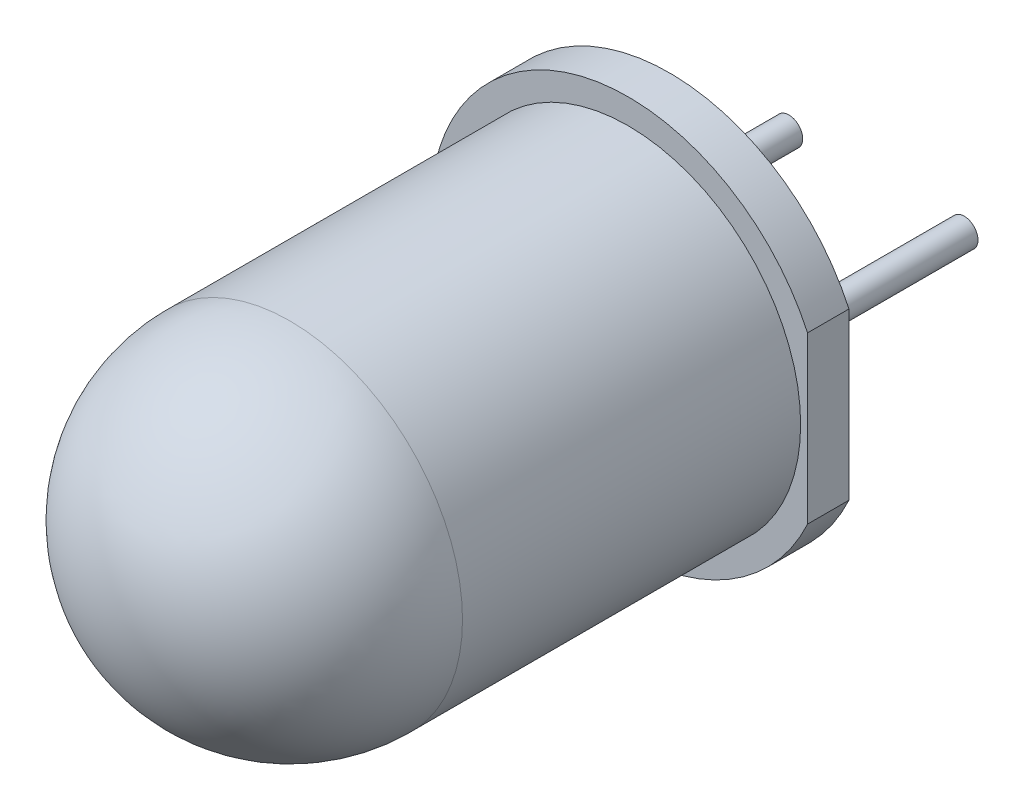
ISO-10303-21;
HEADER;
FILE_DESCRIPTION(('STEP AP214'),'2;1');
FILE_NAME('part.step','',(''),(''),'','','');
FILE_SCHEMA(('AUTOMOTIVE_DESIGN { 1 0 10303 214 1 1 1 1 }'));
ENDSEC;
DATA;
#1=APPLICATION_CONTEXT('core data for automotive mechanical design processes');
#2=APPLICATION_PROTOCOL_DEFINITION('international standard','automotive_design',2000,#1);
#3=PRODUCT_CONTEXT('',#1,'mechanical');
#4=PRODUCT('Part','Part','',(#3));
#5=PRODUCT_RELATED_PRODUCT_CATEGORY('part','',(#4));
#6=PRODUCT_DEFINITION_FORMATION('','',#4);
#7=PRODUCT_DEFINITION_CONTEXT('part definition',#1,'design');
#8=PRODUCT_DEFINITION('design','',#6,#7);
#9=PRODUCT_DEFINITION_SHAPE('','',#8);
#10=(LENGTH_UNIT() NAMED_UNIT(*) SI_UNIT(.MILLI.,.METRE.));
#11=(NAMED_UNIT(*) PLANE_ANGLE_UNIT() SI_UNIT($,.RADIAN.));
#12=(NAMED_UNIT(*) SI_UNIT($,.STERADIAN.) SOLID_ANGLE_UNIT());
#13=UNCERTAINTY_MEASURE_WITH_UNIT(LENGTH_MEASURE(1.E-05),#10,'distance_accuracy_value','');
#14=(GEOMETRIC_REPRESENTATION_CONTEXT(3) GLOBAL_UNCERTAINTY_ASSIGNED_CONTEXT((#13)) GLOBAL_UNIT_ASSIGNED_CONTEXT((#10,
#11,#12)) REPRESENTATION_CONTEXT('',''));
#15=CARTESIAN_POINT('',(0.,0.,0.));
#16=DIRECTION('',(0.,0.,1.));
#17=DIRECTION('',(1.,0.,0.));
#18=AXIS2_PLACEMENT_3D('',#15,#16,#17);
#19=CARTESIAN_POINT('',(0.,0.,0.));
#20=DIRECTION('',(0.,0.,1.));
#21=DIRECTION('',(1.,0.,0.));
#22=AXIS2_PLACEMENT_3D('',#19,#20,#21);
#23=PLANE('',#22);
#24=CARTESIAN_POINT('',(0.,0.,0.));
#25=DIRECTION('',(0.,0.,1.));
#26=DIRECTION('',(1.,0.,0.));
#27=AXIS2_PLACEMENT_3D('',#24,#25,#26);
#28=CIRCLE('',#27,2.86356421265527);
#29=CARTESIAN_POINT('',(2.6,1.2,0.));
#30=VERTEX_POINT('',#29);
#31=CARTESIAN_POINT('',(2.6,-1.2,0.));
#32=VERTEX_POINT('',#31);
#33=EDGE_CURVE('E72',#30,#32,#28,.T.);
#34=ORIENTED_EDGE('',*,*,#33,.F.);
#35=DIRECTION('',(0.,1.,0.));
#36=VECTOR('',#35,1.);
#37=CARTESIAN_POINT('',(2.6,1.2,0.));
#38=LINE('',#37,#36);
#39=EDGE_CURVE('E61',#32,#30,#38,.T.);
#40=ORIENTED_EDGE('',*,*,#39,.F.);
#41=EDGE_LOOP('',(#34,#40));
#42=FACE_BOUND('',#41,.T.);
#43=CARTESIAN_POINT('',(-1.27,0.,0.));
#44=DIRECTION('',(0.,0.,1.));
#45=DIRECTION('',(1.,0.,0.));
#46=AXIS2_PLACEMENT_3D('',#43,#44,#45);
#47=CIRCLE('',#46,0.2);
#48=CARTESIAN_POINT('',(-1.07,0.,0.));
#49=VERTEX_POINT('',#48);
#50=EDGE_CURVE('E46',#49,#49,#47,.F.);
#51=ORIENTED_EDGE('',*,*,#50,.F.);
#52=EDGE_LOOP('',(#51));
#53=FACE_BOUND('',#52,.T.);
#54=CARTESIAN_POINT('',(1.27000000000261,0.,0.));
#55=DIRECTION('',(0.,0.,1.));
#56=DIRECTION('',(1.,0.,0.));
#57=AXIS2_PLACEMENT_3D('',#54,#55,#56);
#58=CIRCLE('',#57,0.2);
#59=CARTESIAN_POINT('',(1.47000000000261,0.,0.));
#60=VERTEX_POINT('',#59);
#61=EDGE_CURVE('E11',#60,#60,#58,.F.);
#62=ORIENTED_EDGE('',*,*,#61,.F.);
#63=EDGE_LOOP('',(#62));
#64=FACE_BOUND('',#63,.T.);
#65=ADVANCED_FACE('F37',(#42,#53,#64),#23,.F.);
#66=CARTESIAN_POINT('',(0.,0.,0.6));
#67=DIRECTION('',(0.,0.,1.));
#68=DIRECTION('',(1.,0.,0.));
#69=AXIS2_PLACEMENT_3D('',#66,#67,#68);
#70=PLANE('',#69);
#71=CARTESIAN_POINT('',(0.,0.,0.6));
#72=DIRECTION('',(0.,0.,1.));
#73=DIRECTION('',(1.,0.,0.));
#74=AXIS2_PLACEMENT_3D('',#71,#72,#73);
#75=CIRCLE('',#74,2.86356421265527);
#76=CARTESIAN_POINT('',(2.6,1.2,0.6));
#77=VERTEX_POINT('',#76);
#78=CARTESIAN_POINT('',(2.6,-1.2,0.6));
#79=VERTEX_POINT('',#78);
#80=EDGE_CURVE('E71',#77,#79,#75,.T.);
#81=ORIENTED_EDGE('',*,*,#80,.T.);
#82=DIRECTION('',(0.,1.,0.));
#83=VECTOR('',#82,1.);
#84=CARTESIAN_POINT('',(2.6,1.2,0.6));
#85=LINE('',#84,#83);
#86=EDGE_CURVE('E53',#79,#77,#85,.T.);
#87=ORIENTED_EDGE('',*,*,#86,.T.);
#88=EDGE_LOOP('',(#81,#87));
#89=FACE_BOUND('',#88,.T.);
#90=CARTESIAN_POINT('',(0.,0.,0.6));
#91=DIRECTION('',(0.,0.,1.));
#92=DIRECTION('',(1.,0.,0.));
#93=AXIS2_PLACEMENT_3D('',#90,#91,#92);
#94=CIRCLE('',#93,2.5);
#95=CARTESIAN_POINT('',(2.5,0.,0.6));
#96=VERTEX_POINT('',#95);
#97=EDGE_CURVE('E78',#96,#96,#94,.T.);
#98=ORIENTED_EDGE('',*,*,#97,.F.);
#99=EDGE_LOOP('',(#98));
#100=FACE_BOUND('',#99,.T.);
#101=ADVANCED_FACE('F95',(#89,#100),#70,.T.);
#102=CARTESIAN_POINT('',(0.,0.,0.6));
#103=DIRECTION('',(0.,0.,-1.));
#104=DIRECTION('',(-1.,0.,0.));
#105=AXIS2_PLACEMENT_3D('',#102,#103,#104);
#106=CYLINDRICAL_SURFACE('',#105,2.86356421265527);
#107=ORIENTED_EDGE('',*,*,#33,.T.);
#108=DIRECTION('',(0.,0.,-1.));
#109=VECTOR('',#108,1.);
#110=CARTESIAN_POINT('',(2.6,-1.2,0.6));
#111=LINE('',#110,#109);
#112=EDGE_CURVE('E69',#79,#32,#111,.T.);
#113=ORIENTED_EDGE('',*,*,#112,.F.);
#114=ORIENTED_EDGE('',*,*,#80,.F.);
#115=DIRECTION('',(0.,0.,-1.));
#116=VECTOR('',#115,1.);
#117=CARTESIAN_POINT('',(2.6,1.2,0.6));
#118=LINE('',#117,#116);
#119=EDGE_CURVE('E66',#77,#30,#118,.T.);
#120=ORIENTED_EDGE('',*,*,#119,.T.);
#121=EDGE_LOOP('',(#107,#113,#114,#120));
#122=FACE_BOUND('',#121,.T.);
#123=ADVANCED_FACE('F75',(#122),#106,.T.);
#124=CARTESIAN_POINT('',(2.6,1.2,0.6));
#125=DIRECTION('',(-1.,0.,0.));
#126=DIRECTION('',(0.,0.,1.));
#127=AXIS2_PLACEMENT_3D('',#124,#125,#126);
#128=PLANE('',#127);
#129=ORIENTED_EDGE('',*,*,#39,.T.);
#130=ORIENTED_EDGE('',*,*,#119,.F.);
#131=ORIENTED_EDGE('',*,*,#86,.F.);
#132=ORIENTED_EDGE('',*,*,#112,.T.);
#133=EDGE_LOOP('',(#129,#130,#131,#132));
#134=FACE_BOUND('',#133,.T.);
#135=ADVANCED_FACE('F65',(#134),#128,.F.);
#136=CARTESIAN_POINT('',(0.,0.,8.));
#137=DIRECTION('',(0.,0.,-1.));
#138=DIRECTION('',(-1.,0.,0.));
#139=AXIS2_PLACEMENT_3D('',#136,#137,#138);
#140=CYLINDRICAL_SURFACE('',#139,2.5);
#141=CARTESIAN_POINT('',(0.,0.,5.5));
#142=DIRECTION('',(0.,0.,-1.));
#143=DIRECTION('',(-1.,0.,0.));
#144=AXIS2_PLACEMENT_3D('',#141,#142,#143);
#145=CIRCLE('',#144,2.5);
#146=CARTESIAN_POINT('',(-2.5,0.,5.5));
#147=VERTEX_POINT('',#146);
#148=EDGE_CURVE('E87',#147,#147,#145,.T.);
#149=ORIENTED_EDGE('',*,*,#148,.T.);
#150=EDGE_LOOP('',(#149));
#151=FACE_BOUND('',#150,.T.);
#152=ORIENTED_EDGE('',*,*,#97,.T.);
#153=EDGE_LOOP('',(#152));
#154=FACE_BOUND('',#153,.T.);
#155=ADVANCED_FACE('F118',(#151,#154),#140,.T.);
#156=CARTESIAN_POINT('',(0.,0.,5.5));
#157=DIRECTION('',(0.,0.,1.));
#158=DIRECTION('',(1.,0.,0.));
#159=AXIS2_PLACEMENT_3D('',#156,#157,#158);
#160=SPHERICAL_SURFACE('',#159,2.5);
#161=ORIENTED_EDGE('',*,*,#148,.F.);
#162=EDGE_LOOP('',(#161));
#163=FACE_BOUND('',#162,.T.);
#164=ADVANCED_FACE('F39',(#163),#160,.T.);
#165=CARTESIAN_POINT('',(-1.27,0.,-3.));
#166=DIRECTION('',(0.,0.,1.));
#167=DIRECTION('',(1.,0.,0.));
#168=AXIS2_PLACEMENT_3D('',#165,#166,#167);
#169=CYLINDRICAL_SURFACE('',#168,0.2);
#170=CARTESIAN_POINT('',(-1.27,0.,-3.));
#171=DIRECTION('',(0.,0.,-1.));
#172=DIRECTION('',(-1.,0.,0.));
#173=AXIS2_PLACEMENT_3D('',#170,#171,#172);
#174=CIRCLE('',#173,0.2);
#175=CARTESIAN_POINT('',(-1.47,0.,-3.));
#176=VERTEX_POINT('',#175);
#177=EDGE_CURVE('E81',#176,#176,#174,.T.);
#178=ORIENTED_EDGE('',*,*,#177,.F.);
#179=EDGE_LOOP('',(#178));
#180=FACE_BOUND('',#179,.T.);
#181=ORIENTED_EDGE('',*,*,#50,.T.);
#182=EDGE_LOOP('',(#181));
#183=FACE_BOUND('',#182,.T.);
#184=ADVANCED_FACE('F92',(#180,#183),#169,.T.);
#185=CARTESIAN_POINT('',(-1.27,0.,-3.));
#186=DIRECTION('',(0.,0.,-1.));
#187=DIRECTION('',(-1.,0.,0.));
#188=AXIS2_PLACEMENT_3D('',#185,#186,#187);
#189=PLANE('',#188);
#190=ORIENTED_EDGE('',*,*,#177,.T.);
#191=EDGE_LOOP('',(#190));
#192=FACE_BOUND('',#191,.T.);
#193=ADVANCED_FACE('F102',(#192),#189,.T.);
#194=CARTESIAN_POINT('',(1.27000000000261,0.,-3.));
#195=DIRECTION('',(0.,0.,1.));
#196=DIRECTION('',(1.,0.,0.));
#197=AXIS2_PLACEMENT_3D('',#194,#195,#196);
#198=CYLINDRICAL_SURFACE('',#197,0.2);
#199=CARTESIAN_POINT('',(1.27000000000261,0.,-3.));
#200=DIRECTION('',(0.,0.,-1.));
#201=DIRECTION('',(-1.,0.,0.));
#202=AXIS2_PLACEMENT_3D('',#199,#200,#201);
#203=CIRCLE('',#202,0.2);
#204=CARTESIAN_POINT('',(1.07000000000261,0.,-3.));
#205=VERTEX_POINT('',#204);
#206=EDGE_CURVE('E205',#205,#205,#203,.T.);
#207=ORIENTED_EDGE('',*,*,#206,.F.);
#208=EDGE_LOOP('',(#207));
#209=FACE_BOUND('',#208,.T.);
#210=ORIENTED_EDGE('',*,*,#61,.T.);
#211=EDGE_LOOP('',(#210));
#212=FACE_BOUND('',#211,.T.);
#213=ADVANCED_FACE('F99',(#209,#212),#198,.T.);
#214=CARTESIAN_POINT('',(1.27000000000261,0.,-3.));
#215=DIRECTION('',(0.,0.,-1.));
#216=DIRECTION('',(-1.,0.,0.));
#217=AXIS2_PLACEMENT_3D('',#214,#215,#216);
#218=PLANE('',#217);
#219=ORIENTED_EDGE('',*,*,#206,.T.);
#220=EDGE_LOOP('',(#219));
#221=FACE_BOUND('',#220,.T.);
#222=ADVANCED_FACE('F101',(#221),#218,.T.);
#223=CLOSED_SHELL('',(#65,#101,#123,#135,#155,#164,#184,#193,#213,#222));
#224=MANIFOLD_SOLID_BREP('B2',#223);
#225=ADVANCED_BREP_SHAPE_REPRESENTATION('',(#18,#224),#14);
#226=SHAPE_DEFINITION_REPRESENTATION(#9,#225);
ENDSEC;
END-ISO-10303-21;
